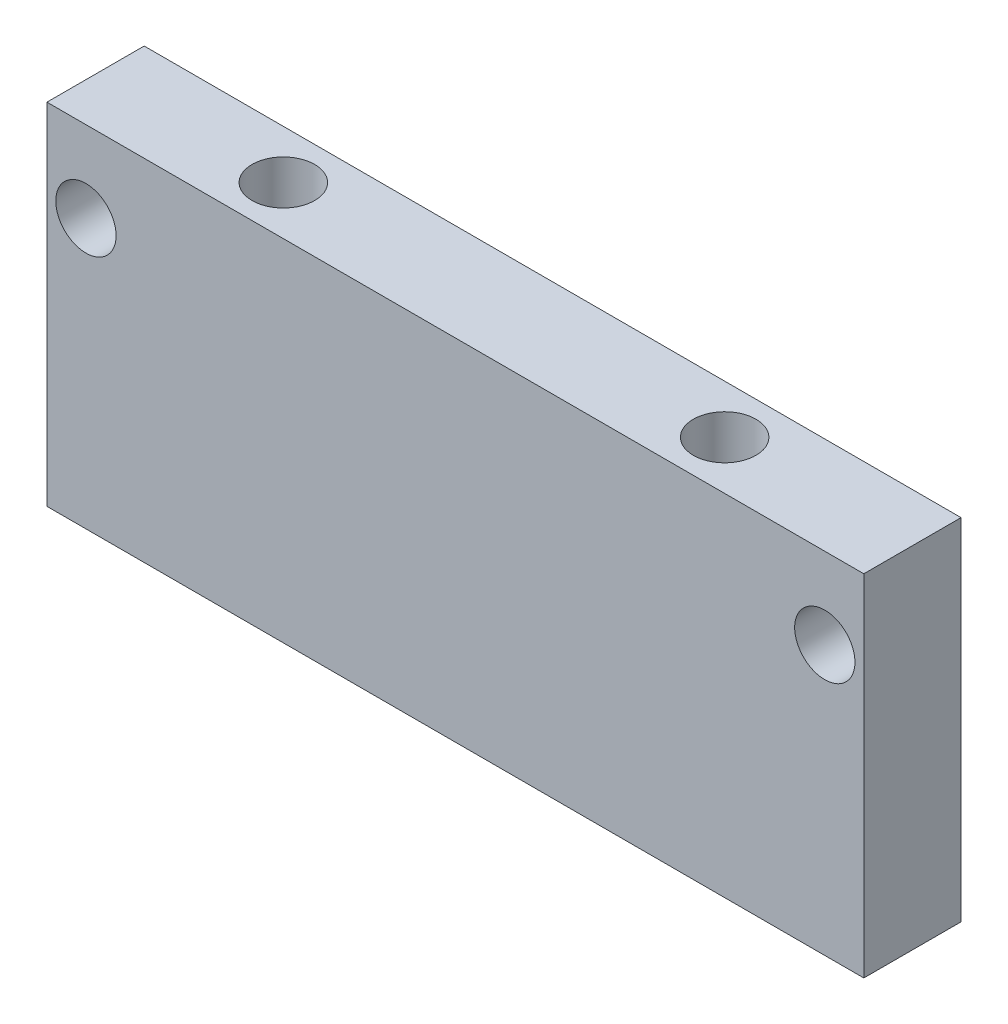
ISO-10303-21;
HEADER;
FILE_DESCRIPTION(('STEP AP214'),'2;1');
FILE_NAME('part.step','',(''),(''),'','','');
FILE_SCHEMA(('AUTOMOTIVE_DESIGN { 1 0 10303 214 1 1 1 1 }'));
ENDSEC;
DATA;
#1=APPLICATION_CONTEXT('core data for automotive mechanical design processes');
#2=APPLICATION_PROTOCOL_DEFINITION('international standard','automotive_design',2000,#1);
#3=PRODUCT_CONTEXT('',#1,'mechanical');
#4=PRODUCT('Part','Part','',(#3));
#5=PRODUCT_RELATED_PRODUCT_CATEGORY('part','',(#4));
#6=PRODUCT_DEFINITION_FORMATION('','',#4);
#7=PRODUCT_DEFINITION_CONTEXT('part definition',#1,'design');
#8=PRODUCT_DEFINITION('design','',#6,#7);
#9=PRODUCT_DEFINITION_SHAPE('','',#8);
#10=(LENGTH_UNIT() NAMED_UNIT(*) SI_UNIT(.MILLI.,.METRE.));
#11=(NAMED_UNIT(*) PLANE_ANGLE_UNIT() SI_UNIT($,.RADIAN.));
#12=(NAMED_UNIT(*) SI_UNIT($,.STERADIAN.) SOLID_ANGLE_UNIT());
#13=UNCERTAINTY_MEASURE_WITH_UNIT(LENGTH_MEASURE(1.E-05),#10,'distance_accuracy_value','');
#14=(GEOMETRIC_REPRESENTATION_CONTEXT(3) GLOBAL_UNCERTAINTY_ASSIGNED_CONTEXT((#13)) GLOBAL_UNIT_ASSIGNED_CONTEXT((#10,
#11,#12)) REPRESENTATION_CONTEXT('',''));
#15=CARTESIAN_POINT('',(0.,0.,0.));
#16=DIRECTION('',(0.,0.,1.));
#17=DIRECTION('',(1.,0.,0.));
#18=AXIS2_PLACEMENT_3D('',#15,#16,#17);
#19=CARTESIAN_POINT('',(21.,18.,-2.5));
#20=DIRECTION('',(-1.,0.,0.));
#21=DIRECTION('',(0.,0.,1.));
#22=AXIS2_PLACEMENT_3D('',#19,#20,#21);
#23=PLANE('',#22);
#24=DIRECTION('',(0.,0.,-1.));
#25=VECTOR('',#24,1.);
#26=CARTESIAN_POINT('',(21.,0.,-2.5));
#27=LINE('',#26,#25);
#28=CARTESIAN_POINT('',(21.,0.,2.5));
#29=VERTEX_POINT('',#28);
#30=CARTESIAN_POINT('',(21.,0.,-2.5));
#31=VERTEX_POINT('',#30);
#32=EDGE_CURVE('E113',#29,#31,#27,.T.);
#33=ORIENTED_EDGE('',*,*,#32,.T.);
#34=DIRECTION('',(0.,-1.,0.));
#35=VECTOR('',#34,1.);
#36=CARTESIAN_POINT('',(21.,18.,-2.5));
#37=LINE('',#36,#35);
#38=CARTESIAN_POINT('',(21.,18.,-2.5));
#39=VERTEX_POINT('',#38);
#40=EDGE_CURVE('E11',#39,#31,#37,.T.);
#41=ORIENTED_EDGE('',*,*,#40,.F.);
#42=DIRECTION('',(0.,0.,-1.));
#43=VECTOR('',#42,1.);
#44=CARTESIAN_POINT('',(21.,18.,-2.5));
#45=LINE('',#44,#43);
#46=CARTESIAN_POINT('',(21.,18.,2.5));
#47=VERTEX_POINT('',#46);
#48=EDGE_CURVE('E97',#47,#39,#45,.T.);
#49=ORIENTED_EDGE('',*,*,#48,.F.);
#50=DIRECTION('',(0.,-1.,0.));
#51=VECTOR('',#50,1.);
#52=CARTESIAN_POINT('',(21.,18.,2.5));
#53=LINE('',#52,#51);
#54=EDGE_CURVE('E109',#47,#29,#53,.T.);
#55=ORIENTED_EDGE('',*,*,#54,.T.);
#56=EDGE_LOOP('',(#33,#41,#49,#55));
#57=FACE_BOUND('',#56,.T.);
#58=ADVANCED_FACE('F45',(#57),#23,.F.);
#59=CARTESIAN_POINT('',(-21.,18.,-2.5));
#60=DIRECTION('',(0.,0.,1.));
#61=DIRECTION('',(1.,0.,0.));
#62=AXIS2_PLACEMENT_3D('',#59,#60,#61);
#63=PLANE('',#62);
#64=CARTESIAN_POINT('',(-18.995,13.83,-2.5));
#65=DIRECTION('',(0.,0.,1.));
#66=DIRECTION('',(1.,0.,0.));
#67=AXIS2_PLACEMENT_3D('',#64,#65,#66);
#68=CIRCLE('',#67,1.55);
#69=CARTESIAN_POINT('',(-17.445,13.83,-2.5));
#70=VERTEX_POINT('',#69);
#71=EDGE_CURVE('E117',#70,#70,#68,.T.);
#72=ORIENTED_EDGE('',*,*,#71,.T.);
#73=EDGE_LOOP('',(#72));
#74=FACE_BOUND('',#73,.T.);
#75=CARTESIAN_POINT('',(18.995,13.83,-2.5));
#76=DIRECTION('',(0.,0.,1.));
#77=DIRECTION('',(1.,0.,0.));
#78=AXIS2_PLACEMENT_3D('',#75,#76,#77);
#79=CIRCLE('',#78,1.55);
#80=CARTESIAN_POINT('',(20.545,13.83,-2.5));
#81=VERTEX_POINT('',#80);
#82=EDGE_CURVE('E137',#81,#81,#79,.T.);
#83=ORIENTED_EDGE('',*,*,#82,.T.);
#84=EDGE_LOOP('',(#83));
#85=FACE_BOUND('',#84,.T.);
#86=DIRECTION('',(-1.,0.,0.));
#87=VECTOR('',#86,1.);
#88=CARTESIAN_POINT('',(-21.,0.,-2.5));
#89=LINE('',#88,#87);
#90=CARTESIAN_POINT('',(-21.,0.,-2.5));
#91=VERTEX_POINT('',#90);
#92=EDGE_CURVE('E102',#31,#91,#89,.T.);
#93=ORIENTED_EDGE('',*,*,#92,.T.);
#94=DIRECTION('',(0.,-1.,0.));
#95=VECTOR('',#94,1.);
#96=CARTESIAN_POINT('',(-21.,18.,-2.5));
#97=LINE('',#96,#95);
#98=CARTESIAN_POINT('',(-21.,18.,-2.5));
#99=VERTEX_POINT('',#98);
#100=EDGE_CURVE('E54',#99,#91,#97,.T.);
#101=ORIENTED_EDGE('',*,*,#100,.F.);
#102=DIRECTION('',(-1.,0.,0.));
#103=VECTOR('',#102,1.);
#104=CARTESIAN_POINT('',(-21.,18.,-2.5));
#105=LINE('',#104,#103);
#106=EDGE_CURVE('E92',#39,#99,#105,.T.);
#107=ORIENTED_EDGE('',*,*,#106,.F.);
#108=ORIENTED_EDGE('',*,*,#40,.T.);
#109=EDGE_LOOP('',(#93,#101,#107,#108));
#110=FACE_BOUND('',#109,.T.);
#111=ADVANCED_FACE('F101',(#74,#85,#110),#63,.F.);
#112=CARTESIAN_POINT('',(-21.,18.,-2.5));
#113=DIRECTION('',(1.,0.,0.));
#114=DIRECTION('',(0.,0.,-1.));
#115=AXIS2_PLACEMENT_3D('',#112,#113,#114);
#116=PLANE('',#115);
#117=DIRECTION('',(0.,0.,1.));
#118=VECTOR('',#117,1.);
#119=CARTESIAN_POINT('',(-21.,0.,-2.5));
#120=LINE('',#119,#118);
#121=CARTESIAN_POINT('',(-21.,0.,2.5));
#122=VERTEX_POINT('',#121);
#123=EDGE_CURVE('E79',#91,#122,#120,.T.);
#124=ORIENTED_EDGE('',*,*,#123,.T.);
#125=DIRECTION('',(0.,-1.,0.));
#126=VECTOR('',#125,1.);
#127=CARTESIAN_POINT('',(-21.,18.,2.5));
#128=LINE('',#127,#126);
#129=CARTESIAN_POINT('',(-21.,18.,2.5));
#130=VERTEX_POINT('',#129);
#131=EDGE_CURVE('E104',#130,#122,#128,.T.);
#132=ORIENTED_EDGE('',*,*,#131,.F.);
#133=DIRECTION('',(0.,0.,1.));
#134=VECTOR('',#133,1.);
#135=CARTESIAN_POINT('',(-21.,18.,-2.5));
#136=LINE('',#135,#134);
#137=EDGE_CURVE('E95',#99,#130,#136,.T.);
#138=ORIENTED_EDGE('',*,*,#137,.F.);
#139=ORIENTED_EDGE('',*,*,#100,.T.);
#140=EDGE_LOOP('',(#124,#132,#138,#139));
#141=FACE_BOUND('',#140,.T.);
#142=ADVANCED_FACE('F105',(#141),#116,.F.);
#143=CARTESIAN_POINT('',(-21.,18.,2.5));
#144=DIRECTION('',(0.,0.,-1.));
#145=DIRECTION('',(-1.,0.,0.));
#146=AXIS2_PLACEMENT_3D('',#143,#144,#145);
#147=PLANE('',#146);
#148=CARTESIAN_POINT('',(-18.995,13.83,2.5));
#149=DIRECTION('',(0.,0.,1.));
#150=DIRECTION('',(1.,0.,0.));
#151=AXIS2_PLACEMENT_3D('',#148,#149,#150);
#152=CIRCLE('',#151,1.55);
#153=CARTESIAN_POINT('',(-17.445,13.83,2.5));
#154=VERTEX_POINT('',#153);
#155=EDGE_CURVE('E141',#154,#154,#152,.T.);
#156=ORIENTED_EDGE('',*,*,#155,.F.);
#157=EDGE_LOOP('',(#156));
#158=FACE_BOUND('',#157,.T.);
#159=CARTESIAN_POINT('',(18.995,13.83,2.5));
#160=DIRECTION('',(0.,0.,1.));
#161=DIRECTION('',(1.,0.,0.));
#162=AXIS2_PLACEMENT_3D('',#159,#160,#161);
#163=CIRCLE('',#162,1.55);
#164=CARTESIAN_POINT('',(20.545,13.83,2.5));
#165=VERTEX_POINT('',#164);
#166=EDGE_CURVE('E142',#165,#165,#163,.T.);
#167=ORIENTED_EDGE('',*,*,#166,.F.);
#168=EDGE_LOOP('',(#167));
#169=FACE_BOUND('',#168,.T.);
#170=DIRECTION('',(1.,0.,0.));
#171=VECTOR('',#170,1.);
#172=CARTESIAN_POINT('',(-21.,0.,2.5));
#173=LINE('',#172,#171);
#174=EDGE_CURVE('E85',#122,#29,#173,.T.);
#175=ORIENTED_EDGE('',*,*,#174,.T.);
#176=ORIENTED_EDGE('',*,*,#54,.F.);
#177=DIRECTION('',(1.,0.,0.));
#178=VECTOR('',#177,1.);
#179=CARTESIAN_POINT('',(-21.,18.,2.5));
#180=LINE('',#179,#178);
#181=EDGE_CURVE('E62',#130,#47,#180,.T.);
#182=ORIENTED_EDGE('',*,*,#181,.F.);
#183=ORIENTED_EDGE('',*,*,#131,.T.);
#184=EDGE_LOOP('',(#175,#176,#182,#183));
#185=FACE_BOUND('',#184,.T.);
#186=ADVANCED_FACE('F127',(#158,#169,#185),#147,.F.);
#187=CARTESIAN_POINT('',(0.,18.,0.));
#188=DIRECTION('',(0.,1.,0.));
#189=DIRECTION('',(0.,0.,1.));
#190=AXIS2_PLACEMENT_3D('',#187,#188,#189);
#191=PLANE('',#190);
#192=CARTESIAN_POINT('',(-11.345,18.,0.));
#193=DIRECTION('',(0.,1.,0.));
#194=DIRECTION('',(0.,0.,1.));
#195=AXIS2_PLACEMENT_3D('',#192,#193,#194);
#196=CIRCLE('',#195,1.61);
#197=CARTESIAN_POINT('',(-11.345,18.,1.61));
#198=VERTEX_POINT('',#197);
#199=EDGE_CURVE('E158',#198,#198,#196,.T.);
#200=ORIENTED_EDGE('',*,*,#199,.F.);
#201=EDGE_LOOP('',(#200));
#202=FACE_BOUND('',#201,.T.);
#203=CARTESIAN_POINT('',(11.345,18.,0.));
#204=DIRECTION('',(0.,1.,0.));
#205=DIRECTION('',(0.,0.,1.));
#206=AXIS2_PLACEMENT_3D('',#203,#204,#205);
#207=CIRCLE('',#206,1.61);
#208=CARTESIAN_POINT('',(11.345,18.,1.61));
#209=VERTEX_POINT('',#208);
#210=EDGE_CURVE('E154',#209,#209,#207,.T.);
#211=ORIENTED_EDGE('',*,*,#210,.F.);
#212=EDGE_LOOP('',(#211));
#213=FACE_BOUND('',#212,.T.);
#214=ORIENTED_EDGE('',*,*,#48,.T.);
#215=ORIENTED_EDGE('',*,*,#106,.T.);
#216=ORIENTED_EDGE('',*,*,#137,.T.);
#217=ORIENTED_EDGE('',*,*,#181,.T.);
#218=EDGE_LOOP('',(#214,#215,#216,#217));
#219=FACE_BOUND('',#218,.T.);
#220=ADVANCED_FACE('F93',(#202,#213,#219),#191,.T.);
#221=CARTESIAN_POINT('',(0.,0.,0.));
#222=DIRECTION('',(0.,1.,0.));
#223=DIRECTION('',(0.,0.,1.));
#224=AXIS2_PLACEMENT_3D('',#221,#222,#223);
#225=PLANE('',#224);
#226=CARTESIAN_POINT('',(-11.345,0.,0.));
#227=DIRECTION('',(0.,1.,0.));
#228=DIRECTION('',(0.,0.,1.));
#229=AXIS2_PLACEMENT_3D('',#226,#227,#228);
#230=CIRCLE('',#229,1.61);
#231=CARTESIAN_POINT('',(-11.345,0.,1.61));
#232=VERTEX_POINT('',#231);
#233=EDGE_CURVE('E146',#232,#232,#230,.T.);
#234=ORIENTED_EDGE('',*,*,#233,.T.);
#235=EDGE_LOOP('',(#234));
#236=FACE_BOUND('',#235,.T.);
#237=CARTESIAN_POINT('',(11.345,0.,0.));
#238=DIRECTION('',(0.,1.,0.));
#239=DIRECTION('',(0.,0.,1.));
#240=AXIS2_PLACEMENT_3D('',#237,#238,#239);
#241=CIRCLE('',#240,1.61);
#242=CARTESIAN_POINT('',(11.345,0.,1.61));
#243=VERTEX_POINT('',#242);
#244=EDGE_CURVE('E150',#243,#243,#241,.T.);
#245=ORIENTED_EDGE('',*,*,#244,.T.);
#246=EDGE_LOOP('',(#245));
#247=FACE_BOUND('',#246,.T.);
#248=ORIENTED_EDGE('',*,*,#32,.F.);
#249=ORIENTED_EDGE('',*,*,#174,.F.);
#250=ORIENTED_EDGE('',*,*,#123,.F.);
#251=ORIENTED_EDGE('',*,*,#92,.F.);
#252=EDGE_LOOP('',(#248,#249,#250,#251));
#253=FACE_BOUND('',#252,.T.);
#254=ADVANCED_FACE('F130',(#236,#247,#253),#225,.F.);
#255=CARTESIAN_POINT('',(18.995,13.83,-12.43));
#256=DIRECTION('',(0.,0.,1.));
#257=DIRECTION('',(1.,0.,0.));
#258=AXIS2_PLACEMENT_3D('',#255,#256,#257);
#259=CYLINDRICAL_SURFACE('',#258,1.55);
#260=ORIENTED_EDGE('',*,*,#166,.T.);
#261=EDGE_LOOP('',(#260));
#262=FACE_BOUND('',#261,.T.);
#263=ORIENTED_EDGE('',*,*,#82,.F.);
#264=EDGE_LOOP('',(#263));
#265=FACE_BOUND('',#264,.T.);
#266=ADVANCED_FACE('F188',(#262,#265),#259,.F.);
#267=CARTESIAN_POINT('',(-18.995,13.83,-12.43));
#268=DIRECTION('',(0.,0.,1.));
#269=DIRECTION('',(1.,0.,0.));
#270=AXIS2_PLACEMENT_3D('',#267,#268,#269);
#271=CYLINDRICAL_SURFACE('',#270,1.55);
#272=ORIENTED_EDGE('',*,*,#155,.T.);
#273=EDGE_LOOP('',(#272));
#274=FACE_BOUND('',#273,.T.);
#275=ORIENTED_EDGE('',*,*,#71,.F.);
#276=EDGE_LOOP('',(#275));
#277=FACE_BOUND('',#276,.T.);
#278=ADVANCED_FACE('F181',(#274,#277),#271,.F.);
#279=CARTESIAN_POINT('',(11.345,0.,0.));
#280=DIRECTION('',(0.,1.,0.));
#281=DIRECTION('',(0.,0.,1.));
#282=AXIS2_PLACEMENT_3D('',#279,#280,#281);
#283=CYLINDRICAL_SURFACE('',#282,1.61);
#284=ORIENTED_EDGE('',*,*,#244,.F.);
#285=EDGE_LOOP('',(#284));
#286=FACE_BOUND('',#285,.T.);
#287=ORIENTED_EDGE('',*,*,#210,.T.);
#288=EDGE_LOOP('',(#287));
#289=FACE_BOUND('',#288,.T.);
#290=ADVANCED_FACE('F171',(#286,#289),#283,.F.);
#291=CARTESIAN_POINT('',(-11.345,0.,0.));
#292=DIRECTION('',(0.,1.,0.));
#293=DIRECTION('',(0.,0.,1.));
#294=AXIS2_PLACEMENT_3D('',#291,#292,#293);
#295=CYLINDRICAL_SURFACE('',#294,1.61);
#296=ORIENTED_EDGE('',*,*,#233,.F.);
#297=EDGE_LOOP('',(#296));
#298=FACE_BOUND('',#297,.T.);
#299=ORIENTED_EDGE('',*,*,#199,.T.);
#300=EDGE_LOOP('',(#299));
#301=FACE_BOUND('',#300,.T.);
#302=ADVANCED_FACE('F168',(#298,#301),#295,.F.);
#303=CLOSED_SHELL('',(#58,#111,#142,#186,#220,#254,#266,#278,#290,#302));
#304=MANIFOLD_SOLID_BREP('B2',#303);
#305=ADVANCED_BREP_SHAPE_REPRESENTATION('',(#18,#304),#14);
#306=SHAPE_DEFINITION_REPRESENTATION(#9,#305);
ENDSEC;
END-ISO-10303-21;
